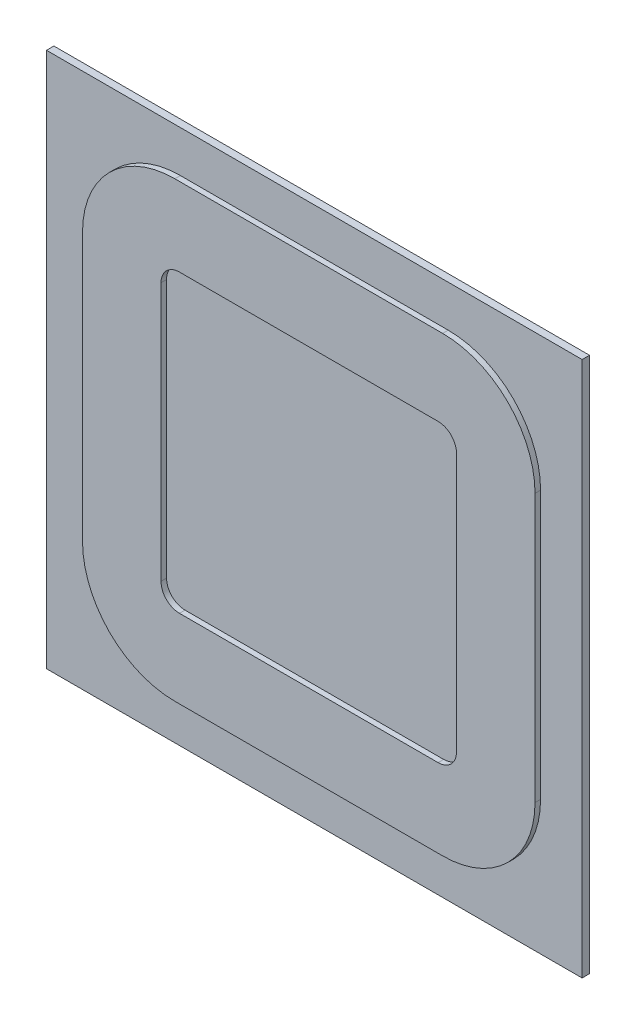
ISO-10303-21;
HEADER;
FILE_DESCRIPTION(('STEP AP214'),'2;1');
FILE_NAME('part.step','',(''),(''),'','','');
FILE_SCHEMA(('AUTOMOTIVE_DESIGN { 1 0 10303 214 1 1 1 1 }'));
ENDSEC;
DATA;
#1=APPLICATION_CONTEXT('core data for automotive mechanical design processes');
#2=APPLICATION_PROTOCOL_DEFINITION('international standard','automotive_design',2000,#1);
#3=PRODUCT_CONTEXT('',#1,'mechanical');
#4=PRODUCT('Part','Part','',(#3));
#5=PRODUCT_RELATED_PRODUCT_CATEGORY('part','',(#4));
#6=PRODUCT_DEFINITION_FORMATION('','',#4);
#7=PRODUCT_DEFINITION_CONTEXT('part definition',#1,'design');
#8=PRODUCT_DEFINITION('design','',#6,#7);
#9=PRODUCT_DEFINITION_SHAPE('','',#8);
#10=(LENGTH_UNIT() NAMED_UNIT(*) SI_UNIT(.MILLI.,.METRE.));
#11=(NAMED_UNIT(*) PLANE_ANGLE_UNIT() SI_UNIT($,.RADIAN.));
#12=(NAMED_UNIT(*) SI_UNIT($,.STERADIAN.) SOLID_ANGLE_UNIT());
#13=UNCERTAINTY_MEASURE_WITH_UNIT(LENGTH_MEASURE(1.E-05),#10,'distance_accuracy_value','');
#14=(GEOMETRIC_REPRESENTATION_CONTEXT(3) GLOBAL_UNCERTAINTY_ASSIGNED_CONTEXT((#13)) GLOBAL_UNIT_ASSIGNED_CONTEXT((#10,
#11,#12)) REPRESENTATION_CONTEXT('',''));
#15=CARTESIAN_POINT('',(0.,0.,0.));
#16=DIRECTION('',(0.,0.,1.));
#17=DIRECTION('',(1.,0.,0.));
#18=AXIS2_PLACEMENT_3D('',#15,#16,#17);
#19=CARTESIAN_POINT('',(0.,0.,0.4));
#20=DIRECTION('',(0.,0.,-1.));
#21=DIRECTION('',(-1.,0.,0.));
#22=AXIS2_PLACEMENT_3D('',#19,#20,#21);
#23=PLANE('',#22);
#24=DIRECTION('',(0.,-1.,0.));
#25=VECTOR('',#24,1.);
#26=CARTESIAN_POINT('',(0.,0.,0.4));
#27=LINE('',#26,#25);
#28=CARTESIAN_POINT('',(0.,29.,0.4));
#29=VERTEX_POINT('',#28);
#30=CARTESIAN_POINT('',(0.,0.,0.4));
#31=VERTEX_POINT('',#30);
#32=EDGE_CURVE('E181',#29,#31,#27,.T.);
#33=ORIENTED_EDGE('',*,*,#32,.T.);
#34=DIRECTION('',(1.,0.,0.));
#35=VECTOR('',#34,1.);
#36=CARTESIAN_POINT('',(0.,0.,0.4));
#37=LINE('',#36,#35);
#38=CARTESIAN_POINT('',(29.,0.,0.4));
#39=VERTEX_POINT('',#38);
#40=EDGE_CURVE('E170',#31,#39,#37,.T.);
#41=ORIENTED_EDGE('',*,*,#40,.T.);
#42=DIRECTION('',(0.,1.,0.));
#43=VECTOR('',#42,1.);
#44=CARTESIAN_POINT('',(29.,0.,0.4));
#45=LINE('',#44,#43);
#46=CARTESIAN_POINT('',(29.,29.,0.4));
#47=VERTEX_POINT('',#46);
#48=EDGE_CURVE('E180',#39,#47,#45,.T.);
#49=ORIENTED_EDGE('',*,*,#48,.T.);
#50=DIRECTION('',(-1.,0.,0.));
#51=VECTOR('',#50,1.);
#52=CARTESIAN_POINT('',(0.,29.,0.4));
#53=LINE('',#52,#51);
#54=EDGE_CURVE('E186',#47,#29,#53,.T.);
#55=ORIENTED_EDGE('',*,*,#54,.T.);
#56=EDGE_LOOP('',(#33,#41,#49,#55));
#57=FACE_BOUND('',#56,.T.);
#58=DIRECTION('',(0.,-1.,0.));
#59=VECTOR('',#58,1.);
#60=CARTESIAN_POINT('',(2.25,26.75,0.4));
#61=LINE('',#60,#59);
#62=CARTESIAN_POINT('',(2.25,21.75,0.4));
#63=VERTEX_POINT('',#62);
#64=CARTESIAN_POINT('',(2.25,7.25,0.4));
#65=VERTEX_POINT('',#64);
#66=EDGE_CURVE('E314',#63,#65,#61,.T.);
#67=ORIENTED_EDGE('',*,*,#66,.F.);
#68=CARTESIAN_POINT('',(7.25,21.75,0.4));
#69=DIRECTION('',(0.,0.,-1.));
#70=DIRECTION('',(-1.,0.,0.));
#71=AXIS2_PLACEMENT_3D('',#68,#69,#70);
#72=CIRCLE('',#71,5.);
#73=CARTESIAN_POINT('',(7.25,26.75,0.4));
#74=VERTEX_POINT('',#73);
#75=EDGE_CURVE('E234',#63,#74,#72,.T.);
#76=ORIENTED_EDGE('',*,*,#75,.T.);
#77=DIRECTION('',(-1.,0.,0.));
#78=VECTOR('',#77,1.);
#79=CARTESIAN_POINT('',(2.25,26.75,0.4));
#80=LINE('',#79,#78);
#81=CARTESIAN_POINT('',(21.75,26.75,0.4));
#82=VERTEX_POINT('',#81);
#83=EDGE_CURVE('E305',#82,#74,#80,.T.);
#84=ORIENTED_EDGE('',*,*,#83,.F.);
#85=CARTESIAN_POINT('',(21.75,21.75,0.4));
#86=DIRECTION('',(0.,0.,-1.));
#87=DIRECTION('',(-1.,0.,0.));
#88=AXIS2_PLACEMENT_3D('',#85,#86,#87);
#89=CIRCLE('',#88,5.);
#90=CARTESIAN_POINT('',(26.75,21.75,0.4));
#91=VERTEX_POINT('',#90);
#92=EDGE_CURVE('E232',#82,#91,#89,.T.);
#93=ORIENTED_EDGE('',*,*,#92,.T.);
#94=DIRECTION('',(0.,1.,0.));
#95=VECTOR('',#94,1.);
#96=CARTESIAN_POINT('',(26.75,26.75,0.4));
#97=LINE('',#96,#95);
#98=CARTESIAN_POINT('',(26.75,7.25,0.4));
#99=VERTEX_POINT('',#98);
#100=EDGE_CURVE('E320',#99,#91,#97,.T.);
#101=ORIENTED_EDGE('',*,*,#100,.F.);
#102=CARTESIAN_POINT('',(21.75,7.25,0.4));
#103=DIRECTION('',(0.,0.,-1.));
#104=DIRECTION('',(-1.,0.,0.));
#105=AXIS2_PLACEMENT_3D('',#102,#103,#104);
#106=CIRCLE('',#105,5.);
#107=CARTESIAN_POINT('',(21.75,2.25,0.4));
#108=VERTEX_POINT('',#107);
#109=EDGE_CURVE('E230',#99,#108,#106,.T.);
#110=ORIENTED_EDGE('',*,*,#109,.T.);
#111=DIRECTION('',(1.,0.,0.));
#112=VECTOR('',#111,1.);
#113=CARTESIAN_POINT('',(2.25,2.25,0.4));
#114=LINE('',#113,#112);
#115=CARTESIAN_POINT('',(7.25,2.25,0.4));
#116=VERTEX_POINT('',#115);
#117=EDGE_CURVE('E317',#116,#108,#114,.T.);
#118=ORIENTED_EDGE('',*,*,#117,.F.);
#119=CARTESIAN_POINT('',(7.25,7.25,0.4));
#120=DIRECTION('',(0.,0.,-1.));
#121=DIRECTION('',(-1.,0.,0.));
#122=AXIS2_PLACEMENT_3D('',#119,#120,#121);
#123=CIRCLE('',#122,5.);
#124=EDGE_CURVE('E228',#116,#65,#123,.T.);
#125=ORIENTED_EDGE('',*,*,#124,.T.);
#126=EDGE_LOOP('',(#67,#76,#84,#93,#101,#110,#118,#125));
#127=FACE_BOUND('',#126,.T.);
#128=ADVANCED_FACE('F33',(#57,#127),#23,.F.);
#129=CARTESIAN_POINT('',(0.,0.,0.4));
#130=DIRECTION('',(1.,0.,0.));
#131=DIRECTION('',(0.,0.,-1.));
#132=AXIS2_PLACEMENT_3D('',#129,#130,#131);
#133=PLANE('',#132);
#134=DIRECTION('',(0.,-1.,0.));
#135=VECTOR('',#134,1.);
#136=CARTESIAN_POINT('',(0.,0.,0.));
#137=LINE('',#136,#135);
#138=CARTESIAN_POINT('',(0.,29.,0.));
#139=VERTEX_POINT('',#138);
#140=CARTESIAN_POINT('',(0.,0.,0.));
#141=VERTEX_POINT('',#140);
#142=EDGE_CURVE('E194',#139,#141,#137,.T.);
#143=ORIENTED_EDGE('',*,*,#142,.T.);
#144=DIRECTION('',(0.,0.,-1.));
#145=VECTOR('',#144,1.);
#146=CARTESIAN_POINT('',(0.,0.,0.4));
#147=LINE('',#146,#145);
#148=EDGE_CURVE('E174',#31,#141,#147,.T.);
#149=ORIENTED_EDGE('',*,*,#148,.F.);
#150=ORIENTED_EDGE('',*,*,#32,.F.);
#151=DIRECTION('',(0.,0.,-1.));
#152=VECTOR('',#151,1.);
#153=CARTESIAN_POINT('',(0.,29.,0.4));
#154=LINE('',#153,#152);
#155=EDGE_CURVE('E327',#29,#139,#154,.T.);
#156=ORIENTED_EDGE('',*,*,#155,.T.);
#157=EDGE_LOOP('',(#143,#149,#150,#156));
#158=FACE_BOUND('',#157,.T.);
#159=ADVANCED_FACE('F192',(#158),#133,.F.);
#160=CARTESIAN_POINT('',(0.,0.,0.4));
#161=DIRECTION('',(0.,1.,0.));
#162=DIRECTION('',(0.,0.,1.));
#163=AXIS2_PLACEMENT_3D('',#160,#161,#162);
#164=PLANE('',#163);
#165=DIRECTION('',(1.,0.,0.));
#166=VECTOR('',#165,1.);
#167=CARTESIAN_POINT('',(0.,0.,0.));
#168=LINE('',#167,#166);
#169=CARTESIAN_POINT('',(29.,0.,0.));
#170=VERTEX_POINT('',#169);
#171=EDGE_CURVE('E329',#141,#170,#168,.T.);
#172=ORIENTED_EDGE('',*,*,#171,.T.);
#173=DIRECTION('',(0.,0.,-1.));
#174=VECTOR('',#173,1.);
#175=CARTESIAN_POINT('',(29.,0.,0.4));
#176=LINE('',#175,#174);
#177=EDGE_CURVE('E177',#39,#170,#176,.T.);
#178=ORIENTED_EDGE('',*,*,#177,.F.);
#179=ORIENTED_EDGE('',*,*,#40,.F.);
#180=ORIENTED_EDGE('',*,*,#148,.T.);
#181=EDGE_LOOP('',(#172,#178,#179,#180));
#182=FACE_BOUND('',#181,.T.);
#183=ADVANCED_FACE('F172',(#182),#164,.F.);
#184=CARTESIAN_POINT('',(29.,0.,0.4));
#185=DIRECTION('',(-1.,0.,0.));
#186=DIRECTION('',(0.,0.,1.));
#187=AXIS2_PLACEMENT_3D('',#184,#185,#186);
#188=PLANE('',#187);
#189=DIRECTION('',(0.,1.,0.));
#190=VECTOR('',#189,1.);
#191=CARTESIAN_POINT('',(29.,0.,0.));
#192=LINE('',#191,#190);
#193=CARTESIAN_POINT('',(29.,29.,0.));
#194=VERTEX_POINT('',#193);
#195=EDGE_CURVE('E331',#170,#194,#192,.T.);
#196=ORIENTED_EDGE('',*,*,#195,.T.);
#197=DIRECTION('',(0.,0.,-1.));
#198=VECTOR('',#197,1.);
#199=CARTESIAN_POINT('',(29.,29.,0.4));
#200=LINE('',#199,#198);
#201=EDGE_CURVE('E199',#47,#194,#200,.T.);
#202=ORIENTED_EDGE('',*,*,#201,.F.);
#203=ORIENTED_EDGE('',*,*,#48,.F.);
#204=ORIENTED_EDGE('',*,*,#177,.T.);
#205=EDGE_LOOP('',(#196,#202,#203,#204));
#206=FACE_BOUND('',#205,.T.);
#207=ADVANCED_FACE('F343',(#206),#188,.F.);
#208=CARTESIAN_POINT('',(0.,29.,0.4));
#209=DIRECTION('',(0.,-1.,0.));
#210=DIRECTION('',(0.,0.,-1.));
#211=AXIS2_PLACEMENT_3D('',#208,#209,#210);
#212=PLANE('',#211);
#213=DIRECTION('',(-1.,0.,0.));
#214=VECTOR('',#213,1.);
#215=CARTESIAN_POINT('',(0.,29.,0.));
#216=LINE('',#215,#214);
#217=EDGE_CURVE('E190',#194,#139,#216,.T.);
#218=ORIENTED_EDGE('',*,*,#217,.T.);
#219=ORIENTED_EDGE('',*,*,#155,.F.);
#220=ORIENTED_EDGE('',*,*,#54,.F.);
#221=ORIENTED_EDGE('',*,*,#201,.T.);
#222=EDGE_LOOP('',(#218,#219,#220,#221));
#223=FACE_BOUND('',#222,.T.);
#224=ADVANCED_FACE('F338',(#223),#212,.F.);
#225=CARTESIAN_POINT('',(0.,0.,0.));
#226=DIRECTION('',(0.,0.,-1.));
#227=DIRECTION('',(-1.,0.,0.));
#228=AXIS2_PLACEMENT_3D('',#225,#226,#227);
#229=PLANE('',#228);
#230=ORIENTED_EDGE('',*,*,#142,.F.);
#231=ORIENTED_EDGE('',*,*,#217,.F.);
#232=ORIENTED_EDGE('',*,*,#195,.F.);
#233=ORIENTED_EDGE('',*,*,#171,.F.);
#234=EDGE_LOOP('',(#230,#231,#232,#233));
#235=FACE_BOUND('',#234,.T.);
#236=ADVANCED_FACE('F342',(#235),#229,.T.);
#237=CARTESIAN_POINT('',(0.,0.,0.7));
#238=DIRECTION('',(0.,0.,1.));
#239=DIRECTION('',(1.,0.,0.));
#240=AXIS2_PLACEMENT_3D('',#237,#238,#239);
#241=PLANE('',#240);
#242=DIRECTION('',(0.,-1.,0.));
#243=VECTOR('',#242,1.);
#244=CARTESIAN_POINT('',(2.25,26.75,0.7));
#245=LINE('',#244,#243);
#246=CARTESIAN_POINT('',(2.25,21.75,0.7));
#247=VERTEX_POINT('',#246);
#248=CARTESIAN_POINT('',(2.25,7.25,0.7));
#249=VERTEX_POINT('',#248);
#250=EDGE_CURVE('E301',#247,#249,#245,.T.);
#251=ORIENTED_EDGE('',*,*,#250,.T.);
#252=CARTESIAN_POINT('',(7.25,7.25,0.7));
#253=DIRECTION('',(0.,0.,1.));
#254=DIRECTION('',(1.,0.,0.));
#255=AXIS2_PLACEMENT_3D('',#252,#253,#254);
#256=CIRCLE('',#255,5.);
#257=CARTESIAN_POINT('',(7.25,2.25,0.7));
#258=VERTEX_POINT('',#257);
#259=EDGE_CURVE('E216',#249,#258,#256,.T.);
#260=ORIENTED_EDGE('',*,*,#259,.T.);
#261=DIRECTION('',(1.,0.,0.));
#262=VECTOR('',#261,1.);
#263=CARTESIAN_POINT('',(2.25,2.25,0.7));
#264=LINE('',#263,#262);
#265=CARTESIAN_POINT('',(21.75,2.25,0.7));
#266=VERTEX_POINT('',#265);
#267=EDGE_CURVE('E304',#258,#266,#264,.T.);
#268=ORIENTED_EDGE('',*,*,#267,.T.);
#269=CARTESIAN_POINT('',(21.75,7.25,0.7));
#270=DIRECTION('',(0.,0.,1.));
#271=DIRECTION('',(1.,0.,0.));
#272=AXIS2_PLACEMENT_3D('',#269,#270,#271);
#273=CIRCLE('',#272,5.);
#274=CARTESIAN_POINT('',(26.75,7.25,0.7));
#275=VERTEX_POINT('',#274);
#276=EDGE_CURVE('E214',#266,#275,#273,.T.);
#277=ORIENTED_EDGE('',*,*,#276,.T.);
#278=DIRECTION('',(0.,1.,0.));
#279=VECTOR('',#278,1.);
#280=CARTESIAN_POINT('',(26.75,26.75,0.7));
#281=LINE('',#280,#279);
#282=CARTESIAN_POINT('',(26.75,21.75,0.7));
#283=VERTEX_POINT('',#282);
#284=EDGE_CURVE('E308',#275,#283,#281,.T.);
#285=ORIENTED_EDGE('',*,*,#284,.T.);
#286=CARTESIAN_POINT('',(21.75,21.75,0.7));
#287=DIRECTION('',(0.,0.,1.));
#288=DIRECTION('',(1.,0.,0.));
#289=AXIS2_PLACEMENT_3D('',#286,#287,#288);
#290=CIRCLE('',#289,5.);
#291=CARTESIAN_POINT('',(21.75,26.75,0.7));
#292=VERTEX_POINT('',#291);
#293=EDGE_CURVE('E212',#283,#292,#290,.T.);
#294=ORIENTED_EDGE('',*,*,#293,.T.);
#295=DIRECTION('',(-1.,0.,0.));
#296=VECTOR('',#295,1.);
#297=CARTESIAN_POINT('',(2.25,26.75,0.7));
#298=LINE('',#297,#296);
#299=CARTESIAN_POINT('',(7.25,26.75,0.7));
#300=VERTEX_POINT('',#299);
#301=EDGE_CURVE('E311',#292,#300,#298,.T.);
#302=ORIENTED_EDGE('',*,*,#301,.T.);
#303=CARTESIAN_POINT('',(7.25,21.75,0.7));
#304=DIRECTION('',(0.,0.,1.));
#305=DIRECTION('',(1.,0.,0.));
#306=AXIS2_PLACEMENT_3D('',#303,#304,#305);
#307=CIRCLE('',#306,5.);
#308=EDGE_CURVE('E210',#300,#247,#307,.T.);
#309=ORIENTED_EDGE('',*,*,#308,.T.);
#310=EDGE_LOOP('',(#251,#260,#268,#277,#285,#294,#302,#309));
#311=FACE_BOUND('',#310,.T.);
#312=DIRECTION('',(1.,0.,0.));
#313=VECTOR('',#312,1.);
#314=CARTESIAN_POINT('',(6.5,6.5,0.7));
#315=LINE('',#314,#313);
#316=CARTESIAN_POINT('',(7.5,6.5,0.7));
#317=VERTEX_POINT('',#316);
#318=CARTESIAN_POINT('',(21.5,6.5,0.7));
#319=VERTEX_POINT('',#318);
#320=EDGE_CURVE('E281',#317,#319,#315,.T.);
#321=ORIENTED_EDGE('',*,*,#320,.F.);
#322=CARTESIAN_POINT('',(7.5,7.5,0.7));
#323=DIRECTION('',(0.,0.,1.));
#324=DIRECTION('',(1.,0.,0.));
#325=AXIS2_PLACEMENT_3D('',#322,#323,#324);
#326=CIRCLE('',#325,1.);
#327=CARTESIAN_POINT('',(6.5,7.5,0.7));
#328=VERTEX_POINT('',#327);
#329=EDGE_CURVE('E11',#317,#328,#326,.F.);
#330=ORIENTED_EDGE('',*,*,#329,.T.);
#331=DIRECTION('',(0.,-1.,0.));
#332=VECTOR('',#331,1.);
#333=CARTESIAN_POINT('',(6.5,22.5,0.7));
#334=LINE('',#333,#332);
#335=CARTESIAN_POINT('',(6.5,21.5,0.7));
#336=VERTEX_POINT('',#335);
#337=EDGE_CURVE('E293',#336,#328,#334,.T.);
#338=ORIENTED_EDGE('',*,*,#337,.F.);
#339=CARTESIAN_POINT('',(7.5,21.5,0.7));
#340=DIRECTION('',(0.,0.,1.));
#341=DIRECTION('',(1.,0.,0.));
#342=AXIS2_PLACEMENT_3D('',#339,#340,#341);
#343=CIRCLE('',#342,1.);
#344=CARTESIAN_POINT('',(7.5,22.5,0.7));
#345=VERTEX_POINT('',#344);
#346=EDGE_CURVE('E263',#336,#345,#343,.F.);
#347=ORIENTED_EDGE('',*,*,#346,.T.);
#348=DIRECTION('',(-1.,0.,0.));
#349=VECTOR('',#348,1.);
#350=CARTESIAN_POINT('',(6.5,22.5,0.7));
#351=LINE('',#350,#349);
#352=CARTESIAN_POINT('',(21.5,22.5,0.7));
#353=VERTEX_POINT('',#352);
#354=EDGE_CURVE('E272',#353,#345,#351,.T.);
#355=ORIENTED_EDGE('',*,*,#354,.F.);
#356=CARTESIAN_POINT('',(21.5,21.5,0.7));
#357=DIRECTION('',(0.,0.,1.));
#358=DIRECTION('',(1.,0.,0.));
#359=AXIS2_PLACEMENT_3D('',#356,#357,#358);
#360=CIRCLE('',#359,1.);
#361=CARTESIAN_POINT('',(22.5,21.5,0.7));
#362=VERTEX_POINT('',#361);
#363=EDGE_CURVE('E265',#353,#362,#360,.F.);
#364=ORIENTED_EDGE('',*,*,#363,.T.);
#365=DIRECTION('',(0.,1.,0.));
#366=VECTOR('',#365,1.);
#367=CARTESIAN_POINT('',(22.5,22.5,0.7));
#368=LINE('',#367,#366);
#369=CARTESIAN_POINT('',(22.5,7.5,0.7));
#370=VERTEX_POINT('',#369);
#371=EDGE_CURVE('E270',#370,#362,#368,.T.);
#372=ORIENTED_EDGE('',*,*,#371,.F.);
#373=CARTESIAN_POINT('',(21.5,7.5,0.7));
#374=DIRECTION('',(0.,0.,1.));
#375=DIRECTION('',(1.,0.,0.));
#376=AXIS2_PLACEMENT_3D('',#373,#374,#375);
#377=CIRCLE('',#376,1.);
#378=EDGE_CURVE('E41',#370,#319,#377,.F.);
#379=ORIENTED_EDGE('',*,*,#378,.T.);
#380=EDGE_LOOP('',(#321,#330,#338,#347,#355,#364,#372,#379));
#381=FACE_BOUND('',#380,.T.);
#382=ADVANCED_FACE('F269',(#311,#381),#241,.T.);
#383=CARTESIAN_POINT('',(2.25,26.75,0.7));
#384=DIRECTION('',(1.,0.,0.));
#385=DIRECTION('',(0.,1.,0.));
#386=AXIS2_PLACEMENT_3D('',#383,#384,#385);
#387=PLANE('',#386);
#388=ORIENTED_EDGE('',*,*,#66,.T.);
#389=DIRECTION('',(0.,0.,-1.));
#390=VECTOR('',#389,1.);
#391=CARTESIAN_POINT('',(2.25,7.25,0.7));
#392=LINE('',#391,#390);
#393=EDGE_CURVE('E208',#65,#249,#392,.F.);
#394=ORIENTED_EDGE('',*,*,#393,.T.);
#395=ORIENTED_EDGE('',*,*,#250,.F.);
#396=DIRECTION('',(0.,0.,-1.));
#397=VECTOR('',#396,1.);
#398=CARTESIAN_POINT('',(2.25,21.75,0.7));
#399=LINE('',#398,#397);
#400=EDGE_CURVE('E205',#247,#63,#399,.T.);
#401=ORIENTED_EDGE('',*,*,#400,.T.);
#402=EDGE_LOOP('',(#388,#394,#395,#401));
#403=FACE_BOUND('',#402,.T.);
#404=ADVANCED_FACE('F385',(#403),#387,.F.);
#405=CARTESIAN_POINT('',(2.25,2.25,0.7));
#406=DIRECTION('',(0.,1.,0.));
#407=DIRECTION('',(0.,0.,1.));
#408=AXIS2_PLACEMENT_3D('',#405,#406,#407);
#409=PLANE('',#408);
#410=ORIENTED_EDGE('',*,*,#267,.F.);
#411=DIRECTION('',(0.,0.,-1.));
#412=VECTOR('',#411,1.);
#413=CARTESIAN_POINT('',(7.25,2.25,0.7));
#414=LINE('',#413,#412);
#415=EDGE_CURVE('E197',#258,#116,#414,.T.);
#416=ORIENTED_EDGE('',*,*,#415,.T.);
#417=ORIENTED_EDGE('',*,*,#117,.T.);
#418=DIRECTION('',(0.,0.,-1.));
#419=VECTOR('',#418,1.);
#420=CARTESIAN_POINT('',(21.75,2.25,0.7));
#421=LINE('',#420,#419);
#422=EDGE_CURVE('E195',#108,#266,#421,.F.);
#423=ORIENTED_EDGE('',*,*,#422,.T.);
#424=EDGE_LOOP('',(#410,#416,#417,#423));
#425=FACE_BOUND('',#424,.T.);
#426=ADVANCED_FACE('F393',(#425),#409,.F.);
#427=CARTESIAN_POINT('',(26.75,26.75,0.7));
#428=DIRECTION('',(-1.,0.,0.));
#429=DIRECTION('',(0.,-1.,0.));
#430=AXIS2_PLACEMENT_3D('',#427,#428,#429);
#431=PLANE('',#430);
#432=ORIENTED_EDGE('',*,*,#284,.F.);
#433=DIRECTION('',(0.,0.,-1.));
#434=VECTOR('',#433,1.);
#435=CARTESIAN_POINT('',(26.75,7.25,0.7));
#436=LINE('',#435,#434);
#437=EDGE_CURVE('E220',#275,#99,#436,.T.);
#438=ORIENTED_EDGE('',*,*,#437,.T.);
#439=ORIENTED_EDGE('',*,*,#100,.T.);
#440=DIRECTION('',(0.,0.,-1.));
#441=VECTOR('',#440,1.);
#442=CARTESIAN_POINT('',(26.75,21.75,0.7));
#443=LINE('',#442,#441);
#444=EDGE_CURVE('E218',#91,#283,#443,.F.);
#445=ORIENTED_EDGE('',*,*,#444,.T.);
#446=EDGE_LOOP('',(#432,#438,#439,#445));
#447=FACE_BOUND('',#446,.T.);
#448=ADVANCED_FACE('F389',(#447),#431,.F.);
#449=CARTESIAN_POINT('',(2.25,26.75,0.7));
#450=DIRECTION('',(0.,-1.,0.));
#451=DIRECTION('',(0.,0.,-1.));
#452=AXIS2_PLACEMENT_3D('',#449,#450,#451);
#453=PLANE('',#452);
#454=ORIENTED_EDGE('',*,*,#301,.F.);
#455=DIRECTION('',(0.,0.,-1.));
#456=VECTOR('',#455,1.);
#457=CARTESIAN_POINT('',(21.75,26.75,0.7));
#458=LINE('',#457,#456);
#459=EDGE_CURVE('E225',#292,#82,#458,.T.);
#460=ORIENTED_EDGE('',*,*,#459,.T.);
#461=ORIENTED_EDGE('',*,*,#83,.T.);
#462=DIRECTION('',(0.,0.,-1.));
#463=VECTOR('',#462,1.);
#464=CARTESIAN_POINT('',(7.25,26.75,0.7));
#465=LINE('',#464,#463);
#466=EDGE_CURVE('E223',#74,#300,#465,.F.);
#467=ORIENTED_EDGE('',*,*,#466,.T.);
#468=EDGE_LOOP('',(#454,#460,#461,#467));
#469=FACE_BOUND('',#468,.T.);
#470=ADVANCED_FACE('F381',(#469),#453,.F.);
#471=CARTESIAN_POINT('',(6.5,22.5,0.7));
#472=DIRECTION('',(1.,0.,0.));
#473=DIRECTION('',(0.,1.,0.));
#474=AXIS2_PLACEMENT_3D('',#471,#472,#473);
#475=PLANE('',#474);
#476=DIRECTION('',(0.,-1.,0.));
#477=VECTOR('',#476,1.);
#478=CARTESIAN_POINT('',(6.5,22.5,0.4));
#479=LINE('',#478,#477);
#480=CARTESIAN_POINT('',(6.5,21.5,0.4));
#481=VERTEX_POINT('',#480);
#482=CARTESIAN_POINT('',(6.5,7.5,0.4));
#483=VERTEX_POINT('',#482);
#484=EDGE_CURVE('E449',#481,#483,#479,.T.);
#485=ORIENTED_EDGE('',*,*,#484,.F.);
#486=DIRECTION('',(0.,0.,-1.));
#487=VECTOR('',#486,1.);
#488=CARTESIAN_POINT('',(6.5,21.5,0.7));
#489=LINE('',#488,#487);
#490=EDGE_CURVE('E252',#481,#336,#489,.F.);
#491=ORIENTED_EDGE('',*,*,#490,.T.);
#492=ORIENTED_EDGE('',*,*,#337,.T.);
#493=DIRECTION('',(0.,0.,-1.));
#494=VECTOR('',#493,1.);
#495=CARTESIAN_POINT('',(6.5,7.5,0.4));
#496=LINE('',#495,#494);
#497=EDGE_CURVE('E249',#328,#483,#496,.T.);
#498=ORIENTED_EDGE('',*,*,#497,.T.);
#499=EDGE_LOOP('',(#485,#491,#492,#498));
#500=FACE_BOUND('',#499,.T.);
#501=ADVANCED_FACE('F378',(#500),#475,.T.);
#502=CARTESIAN_POINT('',(6.5,6.5,0.7));
#503=DIRECTION('',(0.,1.,0.));
#504=DIRECTION('',(-1.,0.,0.));
#505=AXIS2_PLACEMENT_3D('',#502,#503,#504);
#506=PLANE('',#505);
#507=ORIENTED_EDGE('',*,*,#320,.T.);
#508=DIRECTION('',(0.,0.,-1.));
#509=VECTOR('',#508,1.);
#510=CARTESIAN_POINT('',(21.5,6.5,0.4));
#511=LINE('',#510,#509);
#512=CARTESIAN_POINT('',(21.5,6.5,0.4));
#513=VERTEX_POINT('',#512);
#514=EDGE_CURVE('E260',#319,#513,#511,.T.);
#515=ORIENTED_EDGE('',*,*,#514,.T.);
#516=DIRECTION('',(1.,0.,0.));
#517=VECTOR('',#516,1.);
#518=CARTESIAN_POINT('',(6.5,6.5,0.4));
#519=LINE('',#518,#517);
#520=CARTESIAN_POINT('',(7.5,6.5,0.4));
#521=VERTEX_POINT('',#520);
#522=EDGE_CURVE('E297',#521,#513,#519,.T.);
#523=ORIENTED_EDGE('',*,*,#522,.F.);
#524=DIRECTION('',(0.,0.,-1.));
#525=VECTOR('',#524,1.);
#526=CARTESIAN_POINT('',(7.5,6.5,0.7));
#527=LINE('',#526,#525);
#528=EDGE_CURVE('E54',#521,#317,#527,.F.);
#529=ORIENTED_EDGE('',*,*,#528,.T.);
#530=EDGE_LOOP('',(#507,#515,#523,#529));
#531=FACE_BOUND('',#530,.T.);
#532=ADVANCED_FACE('F373',(#531),#506,.T.);
#533=CARTESIAN_POINT('',(22.5,22.5,0.7));
#534=DIRECTION('',(-1.,0.,0.));
#535=DIRECTION('',(0.,-1.,0.));
#536=AXIS2_PLACEMENT_3D('',#533,#534,#535);
#537=PLANE('',#536);
#538=ORIENTED_EDGE('',*,*,#371,.T.);
#539=DIRECTION('',(0.,0.,-1.));
#540=VECTOR('',#539,1.);
#541=CARTESIAN_POINT('',(22.5,21.5,0.4));
#542=LINE('',#541,#540);
#543=CARTESIAN_POINT('',(22.5,21.5,0.4));
#544=VERTEX_POINT('',#543);
#545=EDGE_CURVE('E256',#362,#544,#542,.T.);
#546=ORIENTED_EDGE('',*,*,#545,.T.);
#547=DIRECTION('',(0.,1.,0.));
#548=VECTOR('',#547,1.);
#549=CARTESIAN_POINT('',(22.5,22.5,0.4));
#550=LINE('',#549,#548);
#551=CARTESIAN_POINT('',(22.5,7.5,0.4));
#552=VERTEX_POINT('',#551);
#553=EDGE_CURVE('E289',#552,#544,#550,.T.);
#554=ORIENTED_EDGE('',*,*,#553,.F.);
#555=DIRECTION('',(0.,0.,-1.));
#556=VECTOR('',#555,1.);
#557=CARTESIAN_POINT('',(22.5,7.5,0.7));
#558=LINE('',#557,#556);
#559=EDGE_CURVE('E254',#552,#370,#558,.F.);
#560=ORIENTED_EDGE('',*,*,#559,.T.);
#561=EDGE_LOOP('',(#538,#546,#554,#560));
#562=FACE_BOUND('',#561,.T.);
#563=ADVANCED_FACE('F277',(#562),#537,.T.);
#564=CARTESIAN_POINT('',(6.5,22.5,0.7));
#565=DIRECTION('',(0.,-1.,0.));
#566=DIRECTION('',(0.,0.,-1.));
#567=AXIS2_PLACEMENT_3D('',#564,#565,#566);
#568=PLANE('',#567);
#569=ORIENTED_EDGE('',*,*,#354,.T.);
#570=DIRECTION('',(0.,0.,-1.));
#571=VECTOR('',#570,1.);
#572=CARTESIAN_POINT('',(7.5,22.5,0.4));
#573=LINE('',#572,#571);
#574=CARTESIAN_POINT('',(7.5,22.5,0.4));
#575=VERTEX_POINT('',#574);
#576=EDGE_CURVE('E238',#345,#575,#573,.T.);
#577=ORIENTED_EDGE('',*,*,#576,.T.);
#578=DIRECTION('',(-1.,0.,0.));
#579=VECTOR('',#578,1.);
#580=CARTESIAN_POINT('',(6.5,22.5,0.4));
#581=LINE('',#580,#579);
#582=CARTESIAN_POINT('',(21.5,22.5,0.4));
#583=VERTEX_POINT('',#582);
#584=EDGE_CURVE('E288',#583,#575,#581,.T.);
#585=ORIENTED_EDGE('',*,*,#584,.F.);
#586=DIRECTION('',(0.,0.,-1.));
#587=VECTOR('',#586,1.);
#588=CARTESIAN_POINT('',(21.5,22.5,0.7));
#589=LINE('',#588,#587);
#590=EDGE_CURVE('E236',#583,#353,#589,.F.);
#591=ORIENTED_EDGE('',*,*,#590,.T.);
#592=EDGE_LOOP('',(#569,#577,#585,#591));
#593=FACE_BOUND('',#592,.T.);
#594=ADVANCED_FACE('F291',(#593),#568,.T.);
#595=ORIENTED_EDGE('',*,*,#584,.T.);
#596=CARTESIAN_POINT('',(7.5,21.5,0.4));
#597=DIRECTION('',(0.,0.,-1.));
#598=DIRECTION('',(-1.,0.,0.));
#599=AXIS2_PLACEMENT_3D('',#596,#597,#598);
#600=CIRCLE('',#599,1.);
#601=EDGE_CURVE('E247',#575,#481,#600,.F.);
#602=ORIENTED_EDGE('',*,*,#601,.T.);
#603=ORIENTED_EDGE('',*,*,#484,.T.);
#604=CARTESIAN_POINT('',(7.5,7.5,0.4));
#605=DIRECTION('',(0.,0.,-1.));
#606=DIRECTION('',(-1.,0.,0.));
#607=AXIS2_PLACEMENT_3D('',#604,#605,#606);
#608=CIRCLE('',#607,1.);
#609=EDGE_CURVE('E241',#483,#521,#608,.F.);
#610=ORIENTED_EDGE('',*,*,#609,.T.);
#611=ORIENTED_EDGE('',*,*,#522,.T.);
#612=CARTESIAN_POINT('',(21.5,7.5,0.4));
#613=DIRECTION('',(0.,0.,-1.));
#614=DIRECTION('',(-1.,0.,0.));
#615=AXIS2_PLACEMENT_3D('',#612,#613,#614);
#616=CIRCLE('',#615,1.);
#617=EDGE_CURVE('E243',#513,#552,#616,.F.);
#618=ORIENTED_EDGE('',*,*,#617,.T.);
#619=ORIENTED_EDGE('',*,*,#553,.T.);
#620=CARTESIAN_POINT('',(21.5,21.5,0.4));
#621=DIRECTION('',(0.,0.,-1.));
#622=DIRECTION('',(-1.,0.,0.));
#623=AXIS2_PLACEMENT_3D('',#620,#621,#622);
#624=CIRCLE('',#623,1.);
#625=EDGE_CURVE('E245',#544,#583,#624,.F.);
#626=ORIENTED_EDGE('',*,*,#625,.T.);
#627=EDGE_LOOP('',(#595,#602,#603,#610,#611,#618,#619,#626));
#628=FACE_BOUND('',#627,.T.);
#629=ADVANCED_FACE('F287',(#628),#23,.F.);
#630=CARTESIAN_POINT('',(7.25,7.25,0.7));
#631=DIRECTION('',(0.,0.,-1.));
#632=DIRECTION('',(-1.,0.,0.));
#633=AXIS2_PLACEMENT_3D('',#630,#631,#632);
#634=CYLINDRICAL_SURFACE('',#633,5.);
#635=ORIENTED_EDGE('',*,*,#259,.F.);
#636=ORIENTED_EDGE('',*,*,#393,.F.);
#637=ORIENTED_EDGE('',*,*,#124,.F.);
#638=ORIENTED_EDGE('',*,*,#415,.F.);
#639=EDGE_LOOP('',(#635,#636,#637,#638));
#640=FACE_BOUND('',#639,.T.);
#641=ADVANCED_FACE('F361',(#640),#634,.T.);
#642=CARTESIAN_POINT('',(21.75,7.25,0.7));
#643=DIRECTION('',(0.,0.,-1.));
#644=DIRECTION('',(-1.,0.,0.));
#645=AXIS2_PLACEMENT_3D('',#642,#643,#644);
#646=CYLINDRICAL_SURFACE('',#645,5.);
#647=ORIENTED_EDGE('',*,*,#276,.F.);
#648=ORIENTED_EDGE('',*,*,#422,.F.);
#649=ORIENTED_EDGE('',*,*,#109,.F.);
#650=ORIENTED_EDGE('',*,*,#437,.F.);
#651=EDGE_LOOP('',(#647,#648,#649,#650));
#652=FACE_BOUND('',#651,.T.);
#653=ADVANCED_FACE('F366',(#652),#646,.T.);
#654=CARTESIAN_POINT('',(21.75,21.75,0.7));
#655=DIRECTION('',(0.,0.,-1.));
#656=DIRECTION('',(-1.,0.,0.));
#657=AXIS2_PLACEMENT_3D('',#654,#655,#656);
#658=CYLINDRICAL_SURFACE('',#657,5.);
#659=ORIENTED_EDGE('',*,*,#293,.F.);
#660=ORIENTED_EDGE('',*,*,#444,.F.);
#661=ORIENTED_EDGE('',*,*,#92,.F.);
#662=ORIENTED_EDGE('',*,*,#459,.F.);
#663=EDGE_LOOP('',(#659,#660,#661,#662));
#664=FACE_BOUND('',#663,.T.);
#665=ADVANCED_FACE('F418',(#664),#658,.T.);
#666=CARTESIAN_POINT('',(7.25,21.75,0.7));
#667=DIRECTION('',(0.,0.,-1.));
#668=DIRECTION('',(-1.,0.,0.));
#669=AXIS2_PLACEMENT_3D('',#666,#667,#668);
#670=CYLINDRICAL_SURFACE('',#669,5.);
#671=ORIENTED_EDGE('',*,*,#308,.F.);
#672=ORIENTED_EDGE('',*,*,#466,.F.);
#673=ORIENTED_EDGE('',*,*,#75,.F.);
#674=ORIENTED_EDGE('',*,*,#400,.F.);
#675=EDGE_LOOP('',(#671,#672,#673,#674));
#676=FACE_BOUND('',#675,.T.);
#677=ADVANCED_FACE('F425',(#676),#670,.T.);
#678=CARTESIAN_POINT('',(7.5,21.5,0.7));
#679=DIRECTION('',(0.,0.,1.));
#680=DIRECTION('',(1.,0.,0.));
#681=AXIS2_PLACEMENT_3D('',#678,#679,#680);
#682=CYLINDRICAL_SURFACE('',#681,1.);
#683=ORIENTED_EDGE('',*,*,#346,.F.);
#684=ORIENTED_EDGE('',*,*,#490,.F.);
#685=ORIENTED_EDGE('',*,*,#601,.F.);
#686=ORIENTED_EDGE('',*,*,#576,.F.);
#687=EDGE_LOOP('',(#683,#684,#685,#686));
#688=FACE_BOUND('',#687,.T.);
#689=ADVANCED_FACE('F427',(#688),#682,.F.);
#690=CARTESIAN_POINT('',(21.5,21.5,0.7));
#691=DIRECTION('',(0.,0.,1.));
#692=DIRECTION('',(1.,0.,0.));
#693=AXIS2_PLACEMENT_3D('',#690,#691,#692);
#694=CYLINDRICAL_SURFACE('',#693,1.);
#695=ORIENTED_EDGE('',*,*,#363,.F.);
#696=ORIENTED_EDGE('',*,*,#590,.F.);
#697=ORIENTED_EDGE('',*,*,#625,.F.);
#698=ORIENTED_EDGE('',*,*,#545,.F.);
#699=EDGE_LOOP('',(#695,#696,#697,#698));
#700=FACE_BOUND('',#699,.T.);
#701=ADVANCED_FACE('F283',(#700),#694,.F.);
#702=CARTESIAN_POINT('',(21.5,7.5,0.7));
#703=DIRECTION('',(0.,0.,1.));
#704=DIRECTION('',(1.,0.,0.));
#705=AXIS2_PLACEMENT_3D('',#702,#703,#704);
#706=CYLINDRICAL_SURFACE('',#705,1.);
#707=ORIENTED_EDGE('',*,*,#378,.F.);
#708=ORIENTED_EDGE('',*,*,#559,.F.);
#709=ORIENTED_EDGE('',*,*,#617,.F.);
#710=ORIENTED_EDGE('',*,*,#514,.F.);
#711=EDGE_LOOP('',(#707,#708,#709,#710));
#712=FACE_BOUND('',#711,.T.);
#713=ADVANCED_FACE('F439',(#712),#706,.F.);
#714=CARTESIAN_POINT('',(7.5,7.5,0.7));
#715=DIRECTION('',(0.,0.,1.));
#716=DIRECTION('',(1.,0.,0.));
#717=AXIS2_PLACEMENT_3D('',#714,#715,#716);
#718=CYLINDRICAL_SURFACE('',#717,1.);
#719=ORIENTED_EDGE('',*,*,#329,.F.);
#720=ORIENTED_EDGE('',*,*,#528,.F.);
#721=ORIENTED_EDGE('',*,*,#609,.F.);
#722=ORIENTED_EDGE('',*,*,#497,.F.);
#723=EDGE_LOOP('',(#719,#720,#721,#722));
#724=FACE_BOUND('',#723,.T.);
#725=ADVANCED_FACE('F35',(#724),#718,.F.);
#726=CLOSED_SHELL('',(#128,#159,#183,#207,#224,#236,#382,#404,#426,#448,#470,#501,#532,#563,
#594,#629,#641,#653,#665,#677,#689,#701,#713,#725));
#727=MANIFOLD_SOLID_BREP('B2',#726);
#728=ADVANCED_BREP_SHAPE_REPRESENTATION('',(#18,#727),#14);
#729=SHAPE_DEFINITION_REPRESENTATION(#9,#728);
ENDSEC;
END-ISO-10303-21;
